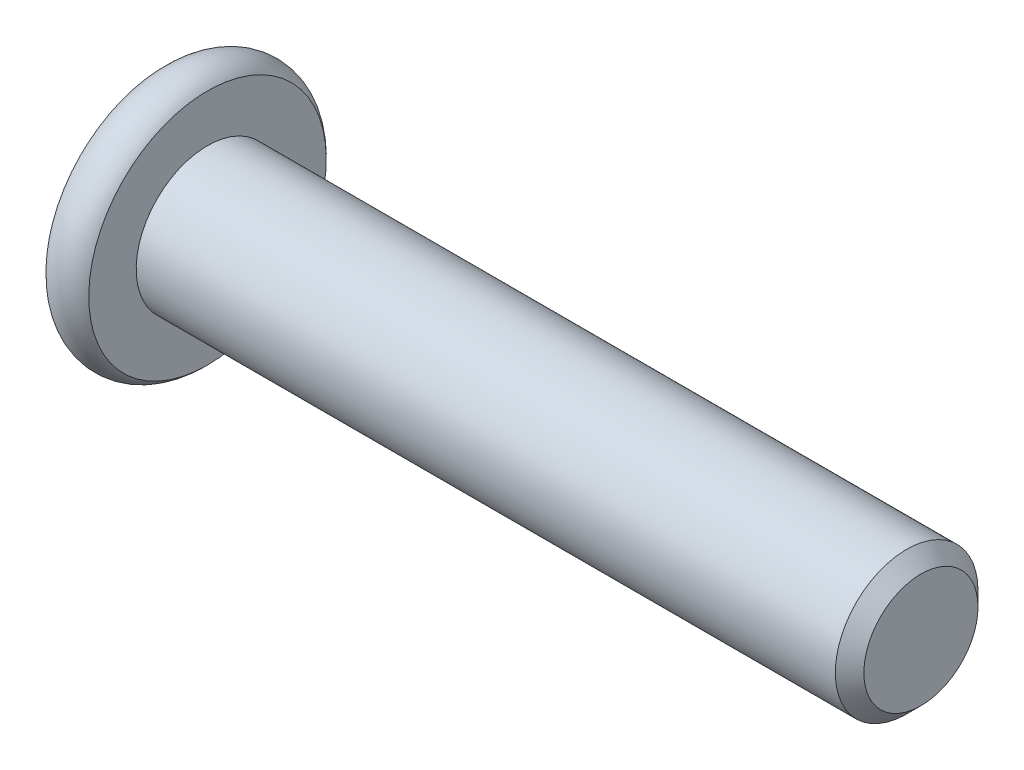
ISO-10303-21;
HEADER;
FILE_DESCRIPTION(('STEP AP214'),'2;1');
FILE_NAME('part.step','',(''),(''),'','','');
FILE_SCHEMA(('AUTOMOTIVE_DESIGN { 1 0 10303 214 1 1 1 1 }'));
ENDSEC;
DATA;
#1=APPLICATION_CONTEXT('core data for automotive mechanical design processes');
#2=APPLICATION_PROTOCOL_DEFINITION('international standard','automotive_design',2000,#1);
#3=PRODUCT_CONTEXT('',#1,'mechanical');
#4=PRODUCT('Part','Part','',(#3));
#5=PRODUCT_RELATED_PRODUCT_CATEGORY('part','',(#4));
#6=PRODUCT_DEFINITION_FORMATION('','',#4);
#7=PRODUCT_DEFINITION_CONTEXT('part definition',#1,'design');
#8=PRODUCT_DEFINITION('design','',#6,#7);
#9=PRODUCT_DEFINITION_SHAPE('','',#8);
#10=(LENGTH_UNIT() NAMED_UNIT(*) SI_UNIT(.MILLI.,.METRE.));
#11=(NAMED_UNIT(*) PLANE_ANGLE_UNIT() SI_UNIT($,.RADIAN.));
#12=(NAMED_UNIT(*) SI_UNIT($,.STERADIAN.) SOLID_ANGLE_UNIT());
#13=UNCERTAINTY_MEASURE_WITH_UNIT(LENGTH_MEASURE(1.E-05),#10,'distance_accuracy_value','');
#14=(GEOMETRIC_REPRESENTATION_CONTEXT(3) GLOBAL_UNCERTAINTY_ASSIGNED_CONTEXT((#13)) GLOBAL_UNIT_ASSIGNED_CONTEXT((#10,
#11,#12)) REPRESENTATION_CONTEXT('',''));
#15=CARTESIAN_POINT('',(0.,0.,0.));
#16=DIRECTION('',(0.,0.,1.));
#17=DIRECTION('',(1.,0.,0.));
#18=AXIS2_PLACEMENT_3D('',#15,#16,#17);
#19=CARTESIAN_POINT('',(-25.,0.,0.));
#20=DIRECTION('',(1.,0.,0.));
#21=DIRECTION('',(0.,0.,-1.));
#22=AXIS2_PLACEMENT_3D('',#19,#20,#21);
#23=CYLINDRICAL_SURFACE('',#22,2.5);
#24=CARTESIAN_POINT('',(-0.500000000000004,0.,0.));
#25=DIRECTION('',(1.,0.,0.));
#26=DIRECTION('',(0.,0.,-1.));
#27=AXIS2_PLACEMENT_3D('',#24,#25,#26);
#28=CIRCLE('',#27,2.5);
#29=CARTESIAN_POINT('',(-0.500000000000004,0.,-2.5));
#30=VERTEX_POINT('',#29);
#31=EDGE_CURVE('E46',#30,#30,#28,.F.);
#32=ORIENTED_EDGE('',*,*,#31,.T.);
#33=EDGE_LOOP('',(#32));
#34=FACE_BOUND('',#33,.T.);
#35=CARTESIAN_POINT('',(-25.,0.,0.));
#36=DIRECTION('',(-1.,0.,0.));
#37=DIRECTION('',(0.,-1.,0.));
#38=AXIS2_PLACEMENT_3D('',#35,#36,#37);
#39=CIRCLE('',#38,2.5);
#40=CARTESIAN_POINT('',(-25.,-2.50000000000001,0.));
#41=VERTEX_POINT('',#40);
#42=EDGE_CURVE('E122',#41,#41,#39,.F.);
#43=ORIENTED_EDGE('',*,*,#42,.T.);
#44=EDGE_LOOP('',(#43));
#45=FACE_BOUND('',#44,.T.);
#46=ADVANCED_FACE('F32',(#34,#45),#23,.T.);
#47=CARTESIAN_POINT('',(0.,0.,0.));
#48=DIRECTION('',(1.,0.,0.));
#49=DIRECTION('',(0.,0.,-1.));
#50=AXIS2_PLACEMENT_3D('',#47,#48,#49);
#51=PLANE('',#50);
#52=CARTESIAN_POINT('',(0.,0.,0.));
#53=DIRECTION('',(1.,0.,0.));
#54=DIRECTION('',(0.,0.,-1.));
#55=AXIS2_PLACEMENT_3D('',#52,#53,#54);
#56=CIRCLE('',#55,1.99999999999999);
#57=CARTESIAN_POINT('',(0.,0.,-1.99999999999999));
#58=VERTEX_POINT('',#57);
#59=EDGE_CURVE('E125',#58,#58,#56,.T.);
#60=ORIENTED_EDGE('',*,*,#59,.T.);
#61=EDGE_LOOP('',(#60));
#62=FACE_BOUND('',#61,.T.);
#63=ADVANCED_FACE('F135',(#62),#51,.T.);
#64=CARTESIAN_POINT('',(0.,0.,0.));
#65=DIRECTION('',(-1.,0.,0.));
#66=DIRECTION('',(0.,0.,1.));
#67=AXIS2_PLACEMENT_3D('',#64,#65,#66);
#68=CONICAL_SURFACE('',#67,1.99999999999999,0.785398163397447);
#69=ORIENTED_EDGE('',*,*,#31,.F.);
#70=EDGE_LOOP('',(#69));
#71=FACE_BOUND('',#70,.T.);
#72=ORIENTED_EDGE('',*,*,#59,.F.);
#73=EDGE_LOOP('',(#72));
#74=FACE_BOUND('',#73,.T.);
#75=ADVANCED_FACE('F34',(#71,#74),#68,.T.);
#76=CARTESIAN_POINT('',(-26.5,0.,0.));
#77=DIRECTION('',(1.,0.,0.));
#78=DIRECTION('',(0.,1.,0.));
#79=AXIS2_PLACEMENT_3D('',#76,#77,#78);
#80=PLANE('',#79);
#81=CARTESIAN_POINT('',(-26.5,1.01169842360595E-13,0.));
#82=DIRECTION('',(-1.,0.,0.));
#83=DIRECTION('',(0.,-1.,0.));
#84=AXIS2_PLACEMENT_3D('',#81,#82,#83);
#85=CIRCLE('',#84,1.78205080756885);
#86=CARTESIAN_POINT('',(-26.5,-1.78205080756875,0.));
#87=VERTEX_POINT('',#86);
#88=EDGE_CURVE('E240',#87,#87,#85,.T.);
#89=ORIENTED_EDGE('',*,*,#88,.F.);
#90=EDGE_LOOP('',(#89));
#91=FACE_BOUND('',#90,.T.);
#92=CARTESIAN_POINT('',(-26.5,0.,0.));
#93=DIRECTION('',(-1.,0.,0.));
#94=DIRECTION('',(0.,-1.,0.));
#95=AXIS2_PLACEMENT_3D('',#92,#93,#94);
#96=CIRCLE('',#95,4.16143782776615);
#97=CARTESIAN_POINT('',(-26.5,-4.16143782776615,0.));
#98=VERTEX_POINT('',#97);
#99=EDGE_CURVE('E119',#98,#98,#96,.T.);
#100=ORIENTED_EDGE('',*,*,#99,.T.);
#101=EDGE_LOOP('',(#100));
#102=FACE_BOUND('',#101,.T.);
#103=ADVANCED_FACE('F134',(#91,#102),#80,.F.);
#104=CARTESIAN_POINT('',(-25.75,0.,0.));
#105=DIRECTION('',(-1.,0.,0.));
#106=DIRECTION('',(0.,-1.,0.));
#107=AXIS2_PLACEMENT_3D('',#104,#105,#106);
#108=TOROIDAL_SURFACE('',#107,3.5,1.);
#109=ORIENTED_EDGE('',*,*,#99,.F.);
#110=EDGE_LOOP('',(#109));
#111=FACE_BOUND('',#110,.T.);
#112=CARTESIAN_POINT('',(-25.,0.,0.));
#113=DIRECTION('',(-1.,0.,0.));
#114=DIRECTION('',(0.,-1.,0.));
#115=AXIS2_PLACEMENT_3D('',#112,#113,#114);
#116=CIRCLE('',#115,4.16143782776615);
#117=CARTESIAN_POINT('',(-25.,-4.16143782776615,0.));
#118=VERTEX_POINT('',#117);
#119=EDGE_CURVE('E116',#118,#118,#116,.T.);
#120=ORIENTED_EDGE('',*,*,#119,.T.);
#121=EDGE_LOOP('',(#120));
#122=FACE_BOUND('',#121,.T.);
#123=ADVANCED_FACE('F146',(#111,#122),#108,.T.);
#124=CARTESIAN_POINT('',(-25.,4.16143782776615,0.));
#125=DIRECTION('',(-1.,0.,0.));
#126=DIRECTION('',(0.,-1.,0.));
#127=AXIS2_PLACEMENT_3D('',#124,#125,#126);
#128=PLANE('',#127);
#129=ORIENTED_EDGE('',*,*,#42,.F.);
#130=EDGE_LOOP('',(#129));
#131=FACE_BOUND('',#130,.T.);
#132=ORIENTED_EDGE('',*,*,#119,.F.);
#133=EDGE_LOOP('',(#132));
#134=FACE_BOUND('',#133,.T.);
#135=ADVANCED_FACE('F150',(#131,#134),#128,.F.);
#136=CARTESIAN_POINT('',(-26.5,1.01169842360595E-13,0.));
#137=DIRECTION('',(-1.,0.,0.));
#138=DIRECTION('',(0.,-1.,0.));
#139=AXIS2_PLACEMENT_3D('',#136,#137,#138);
#140=CONICAL_SURFACE('',#139,1.78205080756885,0.78539816339745);
#141=ORIENTED_EDGE('',*,*,#88,.T.);
#142=EDGE_LOOP('',(#141));
#143=FACE_BOUND('',#142,.T.);
#144=CARTESIAN_POINT('',(-27.015428085613,-1.74023253176571,1.5));
#145=CARTESIAN_POINT('',(-26.9833811073445,-1.69791724929724,1.5));
#146=CARTESIAN_POINT('',(-26.9516444672841,-1.65536760966785,1.5));
#147=CARTESIAN_POINT('',(-26.8889203936153,-1.56970398156678,1.5));
#148=CARTESIAN_POINT('',(-26.85793314822,-1.52658985542842,1.5));
#149=CARTESIAN_POINT('',(-26.765846164345,-1.39562626326557,1.5));
#150=CARTESIAN_POINT('',(-26.7061145123021,-1.30679868010569,1.5));
#151=CARTESIAN_POINT('',(-26.5887342891013,-1.12044622640209,1.5));
#152=CARTESIAN_POINT('',(-26.5314082774823,-1.02271587306666,1.5));
#153=CARTESIAN_POINT('',(-26.426463214976,-0.822357214965194,1.5));
#154=CARTESIAN_POINT('',(-26.3788114236896,-0.719746931701857,1.5));
#155=CARTESIAN_POINT('',(-26.320509988315,-0.565852387095031,1.5));
#156=CARTESIAN_POINT('',(-26.3037990535409,-0.516874191424619,1.5));
#157=CARTESIAN_POINT('',(-26.2743077515089,-0.417723988457458,1.5));
#158=CARTESIAN_POINT('',(-26.2615276514219,-0.367551900263824,1.5));
#159=CARTESIAN_POINT('',(-26.2407784202458,-0.267158299056074,1.5));
#160=CARTESIAN_POINT('',(-26.232726061826,-0.21695426186481,1.5));
#161=CARTESIAN_POINT('',(-26.221591636834,-0.115994915871276,1.5));
#162=CARTESIAN_POINT('',(-26.2185086886377,-0.0652397064614934,1.5));
#163=CARTESIAN_POINT('',(-26.2175473897404,0.0344222234876022,1.5));
#164=CARTESIAN_POINT('',(-26.2194789216952,0.083327170110136,1.5));
#165=CARTESIAN_POINT('',(-26.2280175729677,0.180724293127269,1.5));
#166=CARTESIAN_POINT('',(-26.234625142048,0.229216429361776,1.5));
#167=CARTESIAN_POINT('',(-26.2522650626447,0.326258027697055,1.5));
#168=CARTESIAN_POINT('',(-26.263373168201,0.374793507450076,1.5));
#169=CARTESIAN_POINT('',(-26.2894198669595,0.470802295834229,1.5));
#170=CARTESIAN_POINT('',(-26.3043581560035,0.518275688481332,1.5));
#171=CARTESIAN_POINT('',(-26.356839545716,0.667150562065181,1.5));
#172=CARTESIAN_POINT('',(-26.4003351165442,0.766448362426901,1.5));
#173=CARTESIAN_POINT('',(-26.4970587814836,0.960384405673889,1.5));
#174=CARTESIAN_POINT('',(-26.5503217226675,1.05500437383626,1.5));
#175=CARTESIAN_POINT('',(-26.6602258010454,1.23584520321537,1.5));
#176=CARTESIAN_POINT('',(-26.7165682531046,1.32224986946555,1.5));
#177=CARTESIAN_POINT('',(-26.803675572597,1.44954953726479,1.5));
#178=CARTESIAN_POINT('',(-26.8330199906839,1.49143368482429,1.5));
#179=CARTESIAN_POINT('',(-26.8924869182931,1.5746291478325,1.5));
#180=CARTESIAN_POINT('',(-26.9226092115007,1.61594061772585,1.5));
#181=CARTESIAN_POINT('',(-26.9530541181366,1.65701358742558,1.5));
#182=B_SPLINE_CURVE_WITH_KNOTS('',3,(#144,#145,#146,#147,#148,#149,#150,#151,#152,#153,#154,
#155,#156,#157,#158,#159,#160,#161,#162,#163,#164,#165,#166,#167,#168,#169,#170,#171,#172,#173,
#174,#175,#176,#177,#178,#179,#180,#181),.UNSPECIFIED.,.F.,.F.,(4,2,2,2,2,2,2,2,2,2,2,2,2,2,2,2,
2,2,4),(0.,0.15923897421835,0.318517535014539,0.639504781932382,0.979137893799191,
1.31760168934356,1.47272233841623,1.62785352839775,1.78016486537346,1.93244917778278,
2.07904486260297,2.22565464958331,2.37484213303398,2.52401777304039,2.84828365283774,
3.17372975666749,3.48303030530536,3.63644667013908,3.78982082222912),.UNSPECIFIED.);
#183=CARTESIAN_POINT('',(-26.45,-0.866025403784338,1.5));
#184=VERTEX_POINT('',#183);
#185=CARTESIAN_POINT('',(-26.45,0.866025403784539,1.5));
#186=VERTEX_POINT('',#185);
#187=EDGE_CURVE('E100',#184,#186,#182,.T.);
#188=ORIENTED_EDGE('',*,*,#187,.F.);
#189=CARTESIAN_POINT('',(-26.4501154816001,-1.73216627762261,-0.000200000000000543));
#190=CARTESIAN_POINT('',(-26.4203654760674,-1.70239359975905,0.0513677907370746));
#191=CARTESIAN_POINT('',(-26.3923624839103,-1.67212305186345,0.1037979176652));
#192=CARTESIAN_POINT('',(-26.3410892304402,-1.61039789003609,0.210709034055596));
#193=CARTESIAN_POINT('',(-26.3178475050444,-1.57893740312604,0.265200195814661));
#194=CARTESIAN_POINT('',(-26.2780337289923,-1.51549879897977,0.375079081357249));
#195=CARTESIAN_POINT('',(-26.2613615856709,-1.483536845268,0.4304388090952));
#196=CARTESIAN_POINT('',(-26.2356744568181,-1.41890915196201,0.542377257477151));
#197=CARTESIAN_POINT('',(-26.2266402904789,-1.38624538781108,0.59895255655301));
#198=CARTESIAN_POINT('',(-26.2184890812269,-1.32995210095289,0.696455389516442));
#199=CARTESIAN_POINT('',(-26.2172822529893,-1.30639533311114,0.737256908280468));
#200=CARTESIAN_POINT('',(-26.2193140571623,-1.25932335290183,0.81878796961586));
#201=CARTESIAN_POINT('',(-26.2225536707483,-1.23580815085303,0.859517494314632));
#202=CARTESIAN_POINT('',(-26.233291985982,-1.18900414978416,0.940584402163418));
#203=CARTESIAN_POINT('',(-26.2407946530188,-1.16571558211709,0.98092138459829));
#204=CARTESIAN_POINT('',(-26.2596516119283,-1.11952932016325,1.06091833691403));
#205=CARTESIAN_POINT('',(-26.2710075570186,-1.09663179808776,1.10057800851621));
#206=CARTESIAN_POINT('',(-26.3047216475927,-1.03798159809688,1.20216313477449));
#207=CARTESIAN_POINT('',(-26.3296218490934,-1.00259267147455,1.26345855370969));
#208=CARTESIAN_POINT('',(-26.3716566532716,-0.950557780604274,1.35358562846331));
#209=CARTESIAN_POINT('',(-26.3864251535591,-0.933410759677047,1.38328513990772));
#210=CARTESIAN_POINT('',(-26.4173105659402,-0.899432101996306,1.44213790138375));
#211=CARTESIAN_POINT('',(-26.4334268341217,-0.882600319285609,1.47129140422064));
#212=CARTESIAN_POINT('',(-26.4501154816001,-0.8659099337305,1.5002));
#213=B_SPLINE_CURVE_WITH_KNOTS('',3,(#189,#190,#191,#192,#193,#194,#195,#196,#197,#198,#199,
#200,#201,#202,#203,#204,#205,#206,#207,#208,#209,#210,#211,#212),.UNSPECIFIED.,.F.,.F.,(4,2,2,
2,2,2,2,2,2,2,2,4),(0.,0.199829143693305,0.400822987382389,0.598623720538182,0.795926240188891,
0.937113067959884,1.07833105577193,1.21968061668222,1.36109089931055,1.58570969637565,
1.69770705470964,1.80965120737194),.UNSPECIFIED.);
#214=CARTESIAN_POINT('',(-26.45,-1.73205080756878,0.));
#215=VERTEX_POINT('',#214);
#216=EDGE_CURVE('E196',#215,#184,#213,.T.);
#217=ORIENTED_EDGE('',*,*,#216,.F.);
#218=CARTESIAN_POINT('',(-26.4501154816001,-0.865909933730499,-1.5002));
#219=CARTESIAN_POINT('',(-26.4203654760674,-0.895682611594064,-1.44863220926292));
#220=CARTESIAN_POINT('',(-26.3923624839103,-0.925953159489663,-1.3962020823348));
#221=CARTESIAN_POINT('',(-26.3410892304402,-0.987678321317022,-1.2892909659444));
#222=CARTESIAN_POINT('',(-26.3178475050444,-1.01913880822707,-1.23479980418534));
#223=CARTESIAN_POINT('',(-26.2780337289923,-1.08257741237334,-1.12492091864275));
#224=CARTESIAN_POINT('',(-26.2613615856709,-1.11453936608511,-1.0695611909048));
#225=CARTESIAN_POINT('',(-26.2356744568181,-1.1791670593911,-0.95762274252285));
#226=CARTESIAN_POINT('',(-26.2266402904789,-1.21183082354203,-0.901047443446992));
#227=CARTESIAN_POINT('',(-26.2184890812269,-1.26812411040022,-0.80354461048356));
#228=CARTESIAN_POINT('',(-26.2172822529892,-1.29168087824198,-0.762743091719534));
#229=CARTESIAN_POINT('',(-26.2193140571623,-1.33875285845128,-0.681212030384142));
#230=CARTESIAN_POINT('',(-26.2225536707483,-1.36226806050008,-0.640482505685371));
#231=CARTESIAN_POINT('',(-26.233291985982,-1.40907206156895,-0.559415597836584));
#232=CARTESIAN_POINT('',(-26.2407946530188,-1.43236062923602,-0.519078615401712));
#233=CARTESIAN_POINT('',(-26.2596516119283,-1.47854689118986,-0.439081663085969));
#234=CARTESIAN_POINT('',(-26.2710075570186,-1.50144441326535,-0.399421991483792));
#235=CARTESIAN_POINT('',(-26.3047216475927,-1.56009461325623,-0.297836865225515));
#236=CARTESIAN_POINT('',(-26.3296218490934,-1.59548353987856,-0.236541446290311));
#237=CARTESIAN_POINT('',(-26.3716566532716,-1.64751843074884,-0.146414371536686));
#238=CARTESIAN_POINT('',(-26.3864251535591,-1.66466545167607,-0.116714860092282));
#239=CARTESIAN_POINT('',(-26.4173105659402,-1.69864410935681,-0.0578620986162485));
#240=CARTESIAN_POINT('',(-26.4334268341217,-1.7154758920675,-0.0287085957793625));
#241=CARTESIAN_POINT('',(-26.4501154816001,-1.73216627762261,0.000200000000000116));
#242=B_SPLINE_CURVE_WITH_KNOTS('',3,(#218,#219,#220,#221,#222,#223,#224,#225,#226,#227,#228,
#229,#230,#231,#232,#233,#234,#235,#236,#237,#238,#239,#240,#241),.UNSPECIFIED.,.F.,.F.,(4,2,2,
2,2,2,2,2,2,2,2,4),(0.,0.199829143693304,0.400822987382387,0.59862372053818,0.795926240188889,
0.937113067959881,1.07833105577193,1.21968061668222,1.36109089931054,1.58570969637566,
1.69770705470964,1.80965120737194),.UNSPECIFIED.);
#243=CARTESIAN_POINT('',(-26.45,-0.866025403784337,-1.5));
#244=VERTEX_POINT('',#243);
#245=EDGE_CURVE('E190',#244,#215,#242,.T.);
#246=ORIENTED_EDGE('',*,*,#245,.F.);
#247=CARTESIAN_POINT('',(-27.015428085613,-1.7402325317657,-1.5));
#248=CARTESIAN_POINT('',(-26.9833811073445,-1.69791724929724,-1.5));
#249=CARTESIAN_POINT('',(-26.9516444672841,-1.65536760966785,-1.5));
#250=CARTESIAN_POINT('',(-26.8889203936153,-1.56970398156678,-1.5));
#251=CARTESIAN_POINT('',(-26.85793314822,-1.52658985542842,-1.5));
#252=CARTESIAN_POINT('',(-26.765846164345,-1.39562626326556,-1.5));
#253=CARTESIAN_POINT('',(-26.7061145123021,-1.30679868010569,-1.5));
#254=CARTESIAN_POINT('',(-26.5887342891013,-1.12044622640208,-1.5));
#255=CARTESIAN_POINT('',(-26.5314082774823,-1.02271587306666,-1.5));
#256=CARTESIAN_POINT('',(-26.426463214976,-0.822357214965193,-1.5));
#257=CARTESIAN_POINT('',(-26.3788114236896,-0.719746931701855,-1.5));
#258=CARTESIAN_POINT('',(-26.320509988315,-0.565852387095029,-1.5));
#259=CARTESIAN_POINT('',(-26.3037990535409,-0.516874191424618,-1.5));
#260=CARTESIAN_POINT('',(-26.2743077515089,-0.417723988457457,-1.5));
#261=CARTESIAN_POINT('',(-26.2615276514219,-0.367551900263823,-1.5));
#262=CARTESIAN_POINT('',(-26.2407784202458,-0.267158299056074,-1.5));
#263=CARTESIAN_POINT('',(-26.232726061826,-0.21695426186481,-1.5));
#264=CARTESIAN_POINT('',(-26.221591636834,-0.115994915871276,-1.5));
#265=CARTESIAN_POINT('',(-26.2185086886377,-0.0652397064614942,-1.5));
#266=CARTESIAN_POINT('',(-26.2175473897404,0.0344222234876018,-1.5));
#267=CARTESIAN_POINT('',(-26.2194789216952,0.0833271701101359,-1.5));
#268=CARTESIAN_POINT('',(-26.2280175729677,0.180724293127268,-1.5));
#269=CARTESIAN_POINT('',(-26.234625142048,0.229216429361776,-1.5));
#270=CARTESIAN_POINT('',(-26.2522650626447,0.326258027697055,-1.5));
#271=CARTESIAN_POINT('',(-26.263373168201,0.374793507450076,-1.5));
#272=CARTESIAN_POINT('',(-26.2894198669595,0.470802295834229,-1.5));
#273=CARTESIAN_POINT('',(-26.3043581560035,0.518275688481332,-1.5));
#274=CARTESIAN_POINT('',(-26.356839545716,0.667150562065181,-1.5));
#275=CARTESIAN_POINT('',(-26.4003351165442,0.766448362426901,-1.5));
#276=CARTESIAN_POINT('',(-26.4970587814836,0.960384405673888,-1.5));
#277=CARTESIAN_POINT('',(-26.5503217226675,1.05500437383626,-1.5));
#278=CARTESIAN_POINT('',(-26.6602258010454,1.23584520321537,-1.5));
#279=CARTESIAN_POINT('',(-26.7165682531046,1.32224986946555,-1.5));
#280=CARTESIAN_POINT('',(-26.803675572597,1.44954953726479,-1.5));
#281=CARTESIAN_POINT('',(-26.8330199906839,1.49143368482428,-1.5));
#282=CARTESIAN_POINT('',(-26.8924869182931,1.57462914783249,-1.5));
#283=CARTESIAN_POINT('',(-26.9226092115007,1.61594061772585,-1.5));
#284=CARTESIAN_POINT('',(-26.9530541181366,1.65701358742558,-1.5));
#285=B_SPLINE_CURVE_WITH_KNOTS('',3,(#247,#248,#249,#250,#251,#252,#253,#254,#255,#256,#257,
#258,#259,#260,#261,#262,#263,#264,#265,#266,#267,#268,#269,#270,#271,#272,#273,#274,#275,#276,
#277,#278,#279,#280,#281,#282,#283,#284),.UNSPECIFIED.,.F.,.F.,(4,2,2,2,2,2,2,2,2,2,2,2,2,2,2,2,
2,2,4),(0.,0.159238974218352,0.318517535014539,0.639504781932382,0.979137893799191,
1.31760168934356,1.47272233841623,1.62785352839775,1.78016486537345,1.93244917778278,
2.07904486260296,2.22565464958331,2.37484213303398,2.52401777304038,2.84828365283774,
3.17372975666749,3.48303030530536,3.63644667013907,3.78982082222912),.UNSPECIFIED.);
#286=CARTESIAN_POINT('',(-26.45,0.86602540378454,-1.5));
#287=VERTEX_POINT('',#286);
#288=EDGE_CURVE('E53',#287,#244,#285,.F.);
#289=ORIENTED_EDGE('',*,*,#288,.F.);
#290=CARTESIAN_POINT('',(-26.4501154816001,1.73216627762282,0.000200000000000434));
#291=CARTESIAN_POINT('',(-26.4203654760673,1.70239359975925,-0.051367790737075));
#292=CARTESIAN_POINT('',(-26.3923624839103,1.67212305186365,-0.1037979176652));
#293=CARTESIAN_POINT('',(-26.3410892304402,1.61039789003629,-0.210709034055596));
#294=CARTESIAN_POINT('',(-26.3178475050444,1.57893740312624,-0.26520019581466));
#295=CARTESIAN_POINT('',(-26.2780337289922,1.51549879897997,-0.375079081357248));
#296=CARTESIAN_POINT('',(-26.2613615856709,1.4835368452682,-0.430438809095199));
#297=CARTESIAN_POINT('',(-26.2356744568181,1.41890915196221,-0.54237725747715));
#298=CARTESIAN_POINT('',(-26.2266402904789,1.38624538781128,-0.598952556553008));
#299=CARTESIAN_POINT('',(-26.2184890812269,1.3299521009531,-0.69645538951644));
#300=CARTESIAN_POINT('',(-26.2172822529892,1.30639533311134,-0.737256908280465));
#301=CARTESIAN_POINT('',(-26.2193140571623,1.25932335290203,-0.818787969615857));
#302=CARTESIAN_POINT('',(-26.2225536707483,1.23580815085323,-0.859517494314628));
#303=CARTESIAN_POINT('',(-26.233291985982,1.18900414978437,-0.940584402163415));
#304=CARTESIAN_POINT('',(-26.2407946530188,1.1657155821173,-0.980921384598287));
#305=CARTESIAN_POINT('',(-26.2596516119283,1.11952932016345,-1.06091833691403));
#306=CARTESIAN_POINT('',(-26.2710075570186,1.09663179808796,-1.10057800851621));
#307=CARTESIAN_POINT('',(-26.3047216475927,1.03798159809709,-1.20216313477448));
#308=CARTESIAN_POINT('',(-26.3296218490934,1.00259267147475,-1.26345855370969));
#309=CARTESIAN_POINT('',(-26.3716566532716,0.950557780604476,-1.35358562846331));
#310=CARTESIAN_POINT('',(-26.3864251535591,0.933410759677249,-1.38328513990772));
#311=CARTESIAN_POINT('',(-26.4173105659402,0.899432101996508,-1.44213790138375));
#312=CARTESIAN_POINT('',(-26.4334268341217,0.882600319285811,-1.47129140422064));
#313=CARTESIAN_POINT('',(-26.4501154816001,0.865909933730702,-1.5002));
#314=B_SPLINE_CURVE_WITH_KNOTS('',3,(#290,#291,#292,#293,#294,#295,#296,#297,#298,#299,#300,
#301,#302,#303,#304,#305,#306,#307,#308,#309,#310,#311,#312,#313),.UNSPECIFIED.,.F.,.F.,(4,2,2,
2,2,2,2,2,2,2,2,4),(0.,0.199829143693304,0.400822987382388,0.59862372053818,0.795926240188888,
0.93711306795988,1.07833105577193,1.21968061668222,1.36109089931054,1.58570969637565,
1.69770705470963,1.80965120737194),.UNSPECIFIED.);
#315=CARTESIAN_POINT('',(-26.45,1.73205080756898,0.));
#316=VERTEX_POINT('',#315);
#317=EDGE_CURVE('E11',#316,#287,#314,.T.);
#318=ORIENTED_EDGE('',*,*,#317,.F.);
#319=CARTESIAN_POINT('',(-26.4501154816001,0.865909933730702,1.5002));
#320=CARTESIAN_POINT('',(-26.4203654760674,0.895682611594266,1.44863220926292));
#321=CARTESIAN_POINT('',(-26.3923624839103,0.925953159489866,1.3962020823348));
#322=CARTESIAN_POINT('',(-26.3410892304402,0.987678321317224,1.2892909659444));
#323=CARTESIAN_POINT('',(-26.3178475050444,1.01913880822728,1.23479980418534));
#324=CARTESIAN_POINT('',(-26.2780337289922,1.08257741237354,1.12492091864275));
#325=CARTESIAN_POINT('',(-26.2613615856709,1.11453936608531,1.0695611909048));
#326=CARTESIAN_POINT('',(-26.2356744568181,1.1791670593913,0.957622742522847));
#327=CARTESIAN_POINT('',(-26.2266402904789,1.21183082354223,0.901047443446988));
#328=CARTESIAN_POINT('',(-26.2184890812269,1.26812411040042,0.803544610483556));
#329=CARTESIAN_POINT('',(-26.2172822529892,1.29168087824218,0.76274309171953));
#330=CARTESIAN_POINT('',(-26.2193140571623,1.33875285845148,0.681212030384138));
#331=CARTESIAN_POINT('',(-26.2225536707483,1.36226806050028,0.640482505685367));
#332=CARTESIAN_POINT('',(-26.233291985982,1.40907206156915,0.55941559783658));
#333=CARTESIAN_POINT('',(-26.2407946530188,1.43236062923622,0.519078615401708));
#334=CARTESIAN_POINT('',(-26.2596516119283,1.47854689119007,0.439081663085965));
#335=CARTESIAN_POINT('',(-26.2710075570186,1.50144441326556,0.399421991483788));
#336=CARTESIAN_POINT('',(-26.3047216475927,1.56009461325643,0.297836865225512));
#337=CARTESIAN_POINT('',(-26.3296218490934,1.59548353987876,0.236541446290309));
#338=CARTESIAN_POINT('',(-26.3716566532716,1.64751843074904,0.146414371536685));
#339=CARTESIAN_POINT('',(-26.3864251535591,1.66466545167627,0.116714860092282));
#340=CARTESIAN_POINT('',(-26.4173105659402,1.69864410935701,0.0578620986162492));
#341=CARTESIAN_POINT('',(-26.4334268341217,1.71547589206771,0.0287085957793629));
#342=CARTESIAN_POINT('',(-26.4501154816001,1.73216627762282,-0.000199999999999918));
#343=B_SPLINE_CURVE_WITH_KNOTS('',3,(#319,#320,#321,#322,#323,#324,#325,#326,#327,#328,#329,
#330,#331,#332,#333,#334,#335,#336,#337,#338,#339,#340,#341,#342),.UNSPECIFIED.,.F.,.F.,(4,2,2,
2,2,2,2,2,2,2,2,4),(0.,0.199829143693305,0.400822987382389,0.598623720538182,0.795926240188892,
0.937113067959884,1.07833105577193,1.21968061668222,1.36109089931055,1.58570969637566,
1.69770705470963,1.80965120737194),.UNSPECIFIED.);
#344=EDGE_CURVE('E91',#186,#316,#343,.T.);
#345=ORIENTED_EDGE('',*,*,#344,.F.);
#346=EDGE_LOOP('',(#188,#217,#246,#289,#318,#345));
#347=FACE_BOUND('',#346,.T.);
#348=ADVANCED_FACE('F90',(#143,#347),#140,.F.);
#349=CARTESIAN_POINT('',(-24.2,0.,0.));
#350=DIRECTION('',(-1.,0.,0.));
#351=DIRECTION('',(0.,-1.,0.));
#352=AXIS2_PLACEMENT_3D('',#349,#350,#351);
#353=PLANE('',#352);
#354=DIRECTION('',(0.,0.5,-0.866025403784439));
#355=VECTOR('',#354,1.);
#356=CARTESIAN_POINT('',(-24.2,0.866025403784531,1.5));
#357=LINE('',#356,#355);
#358=CARTESIAN_POINT('',(-24.2,0.866025403784531,1.5));
#359=VERTEX_POINT('',#358);
#360=CARTESIAN_POINT('',(-24.2,1.73205080756897,0.));
#361=VERTEX_POINT('',#360);
#362=EDGE_CURVE('E99',#359,#361,#357,.T.);
#363=ORIENTED_EDGE('',*,*,#362,.T.);
#364=DIRECTION('',(0.,-0.5,-0.866025403784439));
#365=VECTOR('',#364,1.);
#366=CARTESIAN_POINT('',(-24.2,1.73205080756897,0.));
#367=LINE('',#366,#365);
#368=CARTESIAN_POINT('',(-24.2,0.866025403784531,-1.5));
#369=VERTEX_POINT('',#368);
#370=EDGE_CURVE('E104',#361,#369,#367,.T.);
#371=ORIENTED_EDGE('',*,*,#370,.T.);
#372=DIRECTION('',(0.,-1.,0.));
#373=VECTOR('',#372,1.);
#374=CARTESIAN_POINT('',(-24.2,0.866025403784531,-1.5));
#375=LINE('',#374,#373);
#376=CARTESIAN_POINT('',(-24.2,-0.866025403784346,-1.5));
#377=VERTEX_POINT('',#376);
#378=EDGE_CURVE('E222',#369,#377,#375,.T.);
#379=ORIENTED_EDGE('',*,*,#378,.T.);
#380=DIRECTION('',(0.,-0.5,0.866025403784439));
#381=VECTOR('',#380,1.);
#382=CARTESIAN_POINT('',(-24.2,-0.866025403784346,-1.5));
#383=LINE('',#382,#381);
#384=CARTESIAN_POINT('',(-24.2,-1.73205080756878,0.));
#385=VERTEX_POINT('',#384);
#386=EDGE_CURVE('E226',#377,#385,#383,.T.);
#387=ORIENTED_EDGE('',*,*,#386,.T.);
#388=DIRECTION('',(0.,0.5,0.866025403784439));
#389=VECTOR('',#388,1.);
#390=CARTESIAN_POINT('',(-24.2,-1.73205080756878,0.));
#391=LINE('',#390,#389);
#392=CARTESIAN_POINT('',(-24.2,-0.866025403784347,1.5));
#393=VERTEX_POINT('',#392);
#394=EDGE_CURVE('E112',#385,#393,#391,.T.);
#395=ORIENTED_EDGE('',*,*,#394,.T.);
#396=DIRECTION('',(0.,1.,0.));
#397=VECTOR('',#396,1.);
#398=CARTESIAN_POINT('',(-24.2,-0.866025403784347,1.5));
#399=LINE('',#398,#397);
#400=EDGE_CURVE('E107',#393,#359,#399,.T.);
#401=ORIENTED_EDGE('',*,*,#400,.T.);
#402=EDGE_LOOP('',(#363,#371,#379,#387,#395,#401));
#403=FACE_BOUND('',#402,.T.);
#404=ADVANCED_FACE('F176',(#403),#353,.T.);
#405=CARTESIAN_POINT('',(-24.2,1.73205080756897,0.));
#406=DIRECTION('',(0.,0.866025403784439,-0.5));
#407=DIRECTION('',(0.,0.5,0.866025403784439));
#408=AXIS2_PLACEMENT_3D('',#405,#406,#407);
#409=PLANE('',#408);
#410=DIRECTION('',(-1.,0.,0.));
#411=VECTOR('',#410,1.);
#412=CARTESIAN_POINT('',(-24.2,1.73205080756897,0.));
#413=LINE('',#412,#411);
#414=EDGE_CURVE('E97',#361,#316,#413,.T.);
#415=ORIENTED_EDGE('',*,*,#414,.T.);
#416=ORIENTED_EDGE('',*,*,#317,.T.);
#417=DIRECTION('',(-1.,0.,0.));
#418=VECTOR('',#417,1.);
#419=CARTESIAN_POINT('',(-24.2,0.866025403784531,-1.5));
#420=LINE('',#419,#418);
#421=EDGE_CURVE('E106',#369,#287,#420,.T.);
#422=ORIENTED_EDGE('',*,*,#421,.F.);
#423=ORIENTED_EDGE('',*,*,#370,.F.);
#424=EDGE_LOOP('',(#415,#416,#422,#423));
#425=FACE_BOUND('',#424,.T.);
#426=ADVANCED_FACE('F102',(#425),#409,.F.);
#427=CARTESIAN_POINT('',(-24.2,0.866025403784531,-1.5));
#428=DIRECTION('',(0.,0.,-1.));
#429=DIRECTION('',(-1.,0.,0.));
#430=AXIS2_PLACEMENT_3D('',#427,#428,#429);
#431=PLANE('',#430);
#432=ORIENTED_EDGE('',*,*,#421,.T.);
#433=ORIENTED_EDGE('',*,*,#288,.T.);
#434=DIRECTION('',(-1.,0.,0.));
#435=VECTOR('',#434,1.);
#436=CARTESIAN_POINT('',(-24.2,-0.866025403784346,-1.5));
#437=LINE('',#436,#435);
#438=EDGE_CURVE('E109',#377,#244,#437,.T.);
#439=ORIENTED_EDGE('',*,*,#438,.F.);
#440=ORIENTED_EDGE('',*,*,#378,.F.);
#441=EDGE_LOOP('',(#432,#433,#439,#440));
#442=FACE_BOUND('',#441,.T.);
#443=ADVANCED_FACE('F211',(#442),#431,.F.);
#444=CARTESIAN_POINT('',(-24.2,-0.866025403784346,-1.5));
#445=DIRECTION('',(0.,-0.866025403784439,-0.5));
#446=DIRECTION('',(0.,0.5,-0.866025403784438));
#447=AXIS2_PLACEMENT_3D('',#444,#445,#446);
#448=PLANE('',#447);
#449=ORIENTED_EDGE('',*,*,#438,.T.);
#450=ORIENTED_EDGE('',*,*,#245,.T.);
#451=DIRECTION('',(-1.,0.,0.));
#452=VECTOR('',#451,1.);
#453=CARTESIAN_POINT('',(-24.2,-1.73205080756878,0.));
#454=LINE('',#453,#452);
#455=EDGE_CURVE('E236',#385,#215,#454,.T.);
#456=ORIENTED_EDGE('',*,*,#455,.F.);
#457=ORIENTED_EDGE('',*,*,#386,.F.);
#458=EDGE_LOOP('',(#449,#450,#456,#457));
#459=FACE_BOUND('',#458,.T.);
#460=ADVANCED_FACE('F206',(#459),#448,.F.);
#461=CARTESIAN_POINT('',(-24.2,-1.73205080756878,0.));
#462=DIRECTION('',(0.,-0.866025403784439,0.5));
#463=DIRECTION('',(0.,-0.5,-0.866025403784439));
#464=AXIS2_PLACEMENT_3D('',#461,#462,#463);
#465=PLANE('',#464);
#466=ORIENTED_EDGE('',*,*,#455,.T.);
#467=ORIENTED_EDGE('',*,*,#216,.T.);
#468=DIRECTION('',(-1.,0.,0.));
#469=VECTOR('',#468,1.);
#470=CARTESIAN_POINT('',(-24.2,-0.866025403784347,1.5));
#471=LINE('',#470,#469);
#472=EDGE_CURVE('E233',#393,#184,#471,.T.);
#473=ORIENTED_EDGE('',*,*,#472,.F.);
#474=ORIENTED_EDGE('',*,*,#394,.F.);
#475=EDGE_LOOP('',(#466,#467,#473,#474));
#476=FACE_BOUND('',#475,.T.);
#477=ADVANCED_FACE('F203',(#476),#465,.F.);
#478=CARTESIAN_POINT('',(-24.2,-0.866025403784347,1.5));
#479=DIRECTION('',(0.,0.,1.));
#480=DIRECTION('',(1.,0.,0.));
#481=AXIS2_PLACEMENT_3D('',#478,#479,#480);
#482=PLANE('',#481);
#483=ORIENTED_EDGE('',*,*,#472,.T.);
#484=ORIENTED_EDGE('',*,*,#187,.T.);
#485=DIRECTION('',(-1.,0.,0.));
#486=VECTOR('',#485,1.);
#487=CARTESIAN_POINT('',(-24.2,0.866025403784531,1.5));
#488=LINE('',#487,#486);
#489=EDGE_CURVE('E60',#359,#186,#488,.T.);
#490=ORIENTED_EDGE('',*,*,#489,.F.);
#491=ORIENTED_EDGE('',*,*,#400,.F.);
#492=EDGE_LOOP('',(#483,#484,#490,#491));
#493=FACE_BOUND('',#492,.T.);
#494=ADVANCED_FACE('F157',(#493),#482,.F.);
#495=CARTESIAN_POINT('',(-24.2,0.866025403784531,1.5));
#496=DIRECTION('',(0.,0.866025403784439,0.5));
#497=DIRECTION('',(0.,-0.5,0.866025403784439));
#498=AXIS2_PLACEMENT_3D('',#495,#496,#497);
#499=PLANE('',#498);
#500=ORIENTED_EDGE('',*,*,#489,.T.);
#501=ORIENTED_EDGE('',*,*,#344,.T.);
#502=ORIENTED_EDGE('',*,*,#414,.F.);
#503=ORIENTED_EDGE('',*,*,#362,.F.);
#504=EDGE_LOOP('',(#500,#501,#502,#503));
#505=FACE_BOUND('',#504,.T.);
#506=ADVANCED_FACE('F96',(#505),#499,.F.);
#507=CLOSED_SHELL('',(#46,#63,#75,#103,#123,#135,#348,#404,#426,#443,#460,#477,#494,#506));
#508=MANIFOLD_SOLID_BREP('B2',#507);
#509=ADVANCED_BREP_SHAPE_REPRESENTATION('',(#18,#508),#14);
#510=SHAPE_DEFINITION_REPRESENTATION(#9,#509);
ENDSEC;
END-ISO-10303-21;
